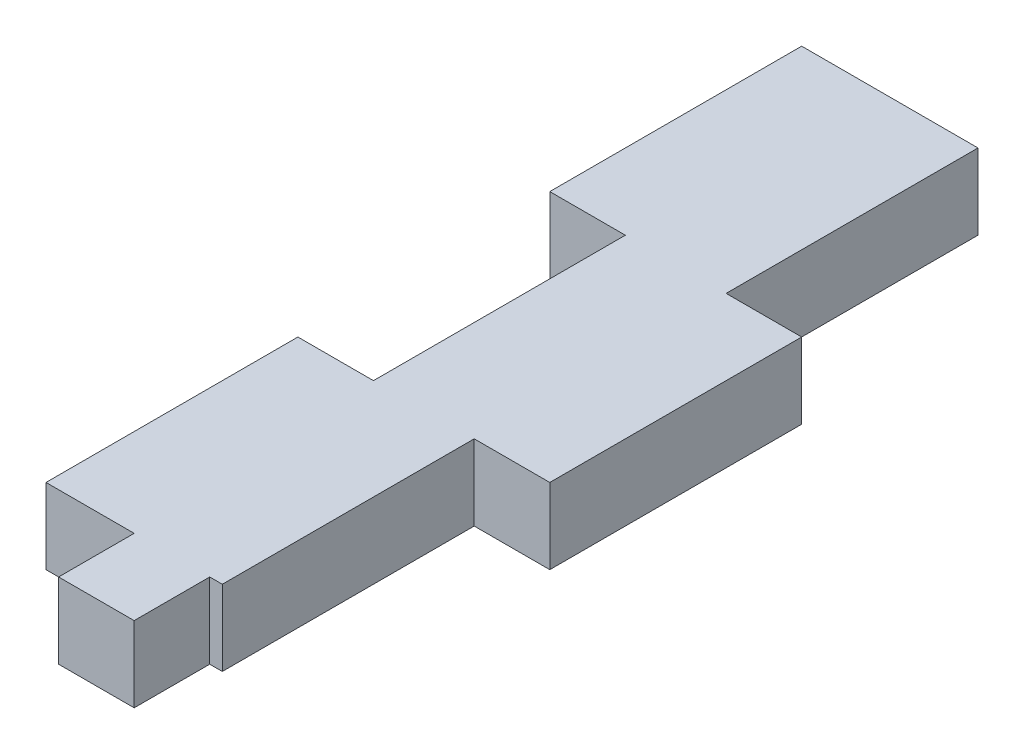
ISO-10303-21;
HEADER;
FILE_DESCRIPTION(('STEP AP214'),'2;1');
FILE_NAME('part.step','',(''),(''),'','','');
FILE_SCHEMA(('AUTOMOTIVE_DESIGN { 1 0 10303 214 1 1 1 1 }'));
ENDSEC;
DATA;
#1=APPLICATION_CONTEXT('core data for automotive mechanical design processes');
#2=APPLICATION_PROTOCOL_DEFINITION('international standard','automotive_design',2000,#1);
#3=PRODUCT_CONTEXT('',#1,'mechanical');
#4=PRODUCT('Part','Part','',(#3));
#5=PRODUCT_RELATED_PRODUCT_CATEGORY('part','',(#4));
#6=PRODUCT_DEFINITION_FORMATION('','',#4);
#7=PRODUCT_DEFINITION_CONTEXT('part definition',#1,'design');
#8=PRODUCT_DEFINITION('design','',#6,#7);
#9=PRODUCT_DEFINITION_SHAPE('','',#8);
#10=(LENGTH_UNIT() NAMED_UNIT(*) SI_UNIT(.MILLI.,.METRE.));
#11=(NAMED_UNIT(*) PLANE_ANGLE_UNIT() SI_UNIT($,.RADIAN.));
#12=(NAMED_UNIT(*) SI_UNIT($,.STERADIAN.) SOLID_ANGLE_UNIT());
#13=UNCERTAINTY_MEASURE_WITH_UNIT(LENGTH_MEASURE(1.E-05),#10,'distance_accuracy_value','');
#14=(GEOMETRIC_REPRESENTATION_CONTEXT(3) GLOBAL_UNCERTAINTY_ASSIGNED_CONTEXT((#13)) GLOBAL_UNIT_ASSIGNED_CONTEXT((#10,
#11,#12)) REPRESENTATION_CONTEXT('',''));
#15=CARTESIAN_POINT('',(0.,0.,0.));
#16=DIRECTION('',(0.,0.,1.));
#17=DIRECTION('',(1.,0.,0.));
#18=AXIS2_PLACEMENT_3D('',#15,#16,#17);
#19=CARTESIAN_POINT('',(0.,3.,10.));
#20=DIRECTION('',(0.,0.,-1.));
#21=DIRECTION('',(-1.,0.,0.));
#22=AXIS2_PLACEMENT_3D('',#19,#20,#21);
#23=PLANE('',#22);
#24=DIRECTION('',(1.,0.,0.));
#25=VECTOR('',#24,1.);
#26=CARTESIAN_POINT('',(0.,0.,10.));
#27=LINE('',#26,#25);
#28=CARTESIAN_POINT('',(0.,0.,10.));
#29=VERTEX_POINT('',#28);
#30=CARTESIAN_POINT('',(3.,0.,10.));
#31=VERTEX_POINT('',#30);
#32=EDGE_CURVE('E198',#29,#31,#27,.T.);
#33=ORIENTED_EDGE('',*,*,#32,.T.);
#34=DIRECTION('',(0.,-1.,0.));
#35=VECTOR('',#34,1.);
#36=CARTESIAN_POINT('',(3.,3.,10.));
#37=LINE('',#36,#35);
#38=CARTESIAN_POINT('',(3.,3.,10.));
#39=VERTEX_POINT('',#38);
#40=EDGE_CURVE('E11',#39,#31,#37,.T.);
#41=ORIENTED_EDGE('',*,*,#40,.F.);
#42=DIRECTION('',(1.,0.,0.));
#43=VECTOR('',#42,1.);
#44=CARTESIAN_POINT('',(0.,3.,10.));
#45=LINE('',#44,#43);
#46=CARTESIAN_POINT('',(0.,3.,10.));
#47=VERTEX_POINT('',#46);
#48=EDGE_CURVE('E375',#47,#39,#45,.T.);
#49=ORIENTED_EDGE('',*,*,#48,.F.);
#50=DIRECTION('',(0.,-1.,0.));
#51=VECTOR('',#50,1.);
#52=CARTESIAN_POINT('',(0.,3.,10.));
#53=LINE('',#52,#51);
#54=EDGE_CURVE('E192',#47,#29,#53,.T.);
#55=ORIENTED_EDGE('',*,*,#54,.T.);
#56=EDGE_LOOP('',(#33,#41,#49,#55));
#57=FACE_BOUND('',#56,.T.);
#58=ADVANCED_FACE('F47',(#57),#23,.F.);
#59=CARTESIAN_POINT('',(3.,3.,0.));
#60=DIRECTION('',(1.,0.,0.));
#61=DIRECTION('',(0.,0.,-1.));
#62=AXIS2_PLACEMENT_3D('',#59,#60,#61);
#63=PLANE('',#62);
#64=DIRECTION('',(0.,0.,1.));
#65=VECTOR('',#64,1.);
#66=CARTESIAN_POINT('',(3.,0.,0.));
#67=LINE('',#66,#65);
#68=CARTESIAN_POINT('',(3.,0.,20.));
#69=VERTEX_POINT('',#68);
#70=EDGE_CURVE('E202',#31,#69,#67,.T.);
#71=ORIENTED_EDGE('',*,*,#70,.T.);
#72=DIRECTION('',(0.,-1.,0.));
#73=VECTOR('',#72,1.);
#74=CARTESIAN_POINT('',(3.,3.,20.));
#75=LINE('',#74,#73);
#76=CARTESIAN_POINT('',(3.,3.,20.));
#77=VERTEX_POINT('',#76);
#78=EDGE_CURVE('E56',#77,#69,#75,.T.);
#79=ORIENTED_EDGE('',*,*,#78,.F.);
#80=DIRECTION('',(0.,0.,1.));
#81=VECTOR('',#80,1.);
#82=CARTESIAN_POINT('',(3.,3.,0.));
#83=LINE('',#82,#81);
#84=EDGE_CURVE('E127',#39,#77,#83,.T.);
#85=ORIENTED_EDGE('',*,*,#84,.F.);
#86=ORIENTED_EDGE('',*,*,#40,.T.);
#87=EDGE_LOOP('',(#71,#79,#85,#86));
#88=FACE_BOUND('',#87,.T.);
#89=ADVANCED_FACE('F292',(#88),#63,.F.);
#90=CARTESIAN_POINT('',(0.,3.,20.));
#91=DIRECTION('',(0.,0.,-1.));
#92=DIRECTION('',(-1.,0.,0.));
#93=AXIS2_PLACEMENT_3D('',#90,#91,#92);
#94=PLANE('',#93);
#95=DIRECTION('',(1.,0.,0.));
#96=VECTOR('',#95,1.);
#97=CARTESIAN_POINT('',(0.,0.,20.));
#98=LINE('',#97,#96);
#99=CARTESIAN_POINT('',(0.,0.,20.));
#100=VERTEX_POINT('',#99);
#101=EDGE_CURVE('E206',#100,#69,#98,.T.);
#102=ORIENTED_EDGE('',*,*,#101,.F.);
#103=DIRECTION('',(0.,-1.,0.));
#104=VECTOR('',#103,1.);
#105=CARTESIAN_POINT('',(0.,3.,20.));
#106=LINE('',#105,#104);
#107=CARTESIAN_POINT('',(0.,3.,20.));
#108=VERTEX_POINT('',#107);
#109=EDGE_CURVE('E283',#108,#100,#106,.T.);
#110=ORIENTED_EDGE('',*,*,#109,.F.);
#111=DIRECTION('',(1.,0.,0.));
#112=VECTOR('',#111,1.);
#113=CARTESIAN_POINT('',(0.,3.,20.));
#114=LINE('',#113,#112);
#115=EDGE_CURVE('E291',#108,#77,#114,.T.);
#116=ORIENTED_EDGE('',*,*,#115,.T.);
#117=ORIENTED_EDGE('',*,*,#78,.T.);
#118=EDGE_LOOP('',(#102,#110,#116,#117));
#119=FACE_BOUND('',#118,.T.);
#120=ADVANCED_FACE('F289',(#119),#94,.T.);
#121=CARTESIAN_POINT('',(0.,3.,0.));
#122=DIRECTION('',(1.,0.,0.));
#123=DIRECTION('',(0.,0.,-1.));
#124=AXIS2_PLACEMENT_3D('',#121,#122,#123);
#125=PLANE('',#124);
#126=DIRECTION('',(0.,0.,1.));
#127=VECTOR('',#126,1.);
#128=CARTESIAN_POINT('',(0.,0.,0.));
#129=LINE('',#128,#127);
#130=CARTESIAN_POINT('',(0.,0.,30.));
#131=VERTEX_POINT('',#130);
#132=EDGE_CURVE('E210',#100,#131,#129,.T.);
#133=ORIENTED_EDGE('',*,*,#132,.T.);
#134=DIRECTION('',(0.,-1.,0.));
#135=VECTOR('',#134,1.);
#136=CARTESIAN_POINT('',(0.,3.,30.));
#137=LINE('',#136,#135);
#138=CARTESIAN_POINT('',(0.,3.,30.));
#139=VERTEX_POINT('',#138);
#140=EDGE_CURVE('E279',#139,#131,#137,.T.);
#141=ORIENTED_EDGE('',*,*,#140,.F.);
#142=DIRECTION('',(0.,0.,1.));
#143=VECTOR('',#142,1.);
#144=CARTESIAN_POINT('',(0.,3.,0.));
#145=LINE('',#144,#143);
#146=EDGE_CURVE('E194',#108,#139,#145,.T.);
#147=ORIENTED_EDGE('',*,*,#146,.F.);
#148=ORIENTED_EDGE('',*,*,#109,.T.);
#149=EDGE_LOOP('',(#133,#141,#147,#148));
#150=FACE_BOUND('',#149,.T.);
#151=ADVANCED_FACE('F302',(#150),#125,.F.);
#152=CARTESIAN_POINT('',(0.,3.,30.));
#153=DIRECTION('',(0.,0.,-1.));
#154=DIRECTION('',(-1.,0.,0.));
#155=AXIS2_PLACEMENT_3D('',#152,#153,#154);
#156=PLANE('',#155);
#157=DIRECTION('',(1.,0.,0.));
#158=VECTOR('',#157,1.);
#159=CARTESIAN_POINT('',(0.,0.,30.));
#160=LINE('',#159,#158);
#161=CARTESIAN_POINT('',(3.5,0.,30.));
#162=VERTEX_POINT('',#161);
#163=EDGE_CURVE('E213',#131,#162,#160,.T.);
#164=ORIENTED_EDGE('',*,*,#163,.T.);
#165=DIRECTION('',(0.,-1.,0.));
#166=VECTOR('',#165,1.);
#167=CARTESIAN_POINT('',(3.5,3.,30.));
#168=LINE('',#167,#166);
#169=CARTESIAN_POINT('',(3.5,3.,30.));
#170=VERTEX_POINT('',#169);
#171=EDGE_CURVE('E275',#170,#162,#168,.T.);
#172=ORIENTED_EDGE('',*,*,#171,.F.);
#173=DIRECTION('',(1.,0.,0.));
#174=VECTOR('',#173,1.);
#175=CARTESIAN_POINT('',(0.,3.,30.));
#176=LINE('',#175,#174);
#177=EDGE_CURVE('E308',#139,#170,#176,.T.);
#178=ORIENTED_EDGE('',*,*,#177,.F.);
#179=ORIENTED_EDGE('',*,*,#140,.T.);
#180=EDGE_LOOP('',(#164,#172,#178,#179));
#181=FACE_BOUND('',#180,.T.);
#182=ADVANCED_FACE('F306',(#181),#156,.F.);
#183=CARTESIAN_POINT('',(3.5,3.,0.));
#184=DIRECTION('',(1.,0.,0.));
#185=DIRECTION('',(0.,0.,-1.));
#186=AXIS2_PLACEMENT_3D('',#183,#184,#185);
#187=PLANE('',#186);
#188=DIRECTION('',(0.,0.,1.));
#189=VECTOR('',#188,1.);
#190=CARTESIAN_POINT('',(3.5,0.,0.));
#191=LINE('',#190,#189);
#192=CARTESIAN_POINT('',(3.5,0.,33.));
#193=VERTEX_POINT('',#192);
#194=EDGE_CURVE('E216',#162,#193,#191,.T.);
#195=ORIENTED_EDGE('',*,*,#194,.T.);
#196=DIRECTION('',(0.,-1.,0.));
#197=VECTOR('',#196,1.);
#198=CARTESIAN_POINT('',(3.5,3.,33.));
#199=LINE('',#198,#197);
#200=CARTESIAN_POINT('',(3.5,3.,33.));
#201=VERTEX_POINT('',#200);
#202=EDGE_CURVE('E271',#201,#193,#199,.T.);
#203=ORIENTED_EDGE('',*,*,#202,.F.);
#204=DIRECTION('',(0.,0.,1.));
#205=VECTOR('',#204,1.);
#206=CARTESIAN_POINT('',(3.5,3.,0.));
#207=LINE('',#206,#205);
#208=EDGE_CURVE('E311',#170,#201,#207,.T.);
#209=ORIENTED_EDGE('',*,*,#208,.F.);
#210=ORIENTED_EDGE('',*,*,#171,.T.);
#211=EDGE_LOOP('',(#195,#203,#209,#210));
#212=FACE_BOUND('',#211,.T.);
#213=ADVANCED_FACE('F397',(#212),#187,.F.);
#214=CARTESIAN_POINT('',(0.,3.,33.));
#215=DIRECTION('',(0.,0.,-1.));
#216=DIRECTION('',(-1.,0.,0.));
#217=AXIS2_PLACEMENT_3D('',#214,#215,#216);
#218=PLANE('',#217);
#219=DIRECTION('',(1.,0.,0.));
#220=VECTOR('',#219,1.);
#221=CARTESIAN_POINT('',(0.,0.,33.));
#222=LINE('',#221,#220);
#223=CARTESIAN_POINT('',(6.5,0.,33.));
#224=VERTEX_POINT('',#223);
#225=EDGE_CURVE('E220',#193,#224,#222,.T.);
#226=ORIENTED_EDGE('',*,*,#225,.T.);
#227=DIRECTION('',(0.,-1.,0.));
#228=VECTOR('',#227,1.);
#229=CARTESIAN_POINT('',(6.5,3.,33.));
#230=LINE('',#229,#228);
#231=CARTESIAN_POINT('',(6.5,3.,33.));
#232=VERTEX_POINT('',#231);
#233=EDGE_CURVE('E268',#232,#224,#230,.T.);
#234=ORIENTED_EDGE('',*,*,#233,.F.);
#235=DIRECTION('',(1.,0.,0.));
#236=VECTOR('',#235,1.);
#237=CARTESIAN_POINT('',(0.,3.,33.));
#238=LINE('',#237,#236);
#239=EDGE_CURVE('E316',#201,#232,#238,.T.);
#240=ORIENTED_EDGE('',*,*,#239,.F.);
#241=ORIENTED_EDGE('',*,*,#202,.T.);
#242=EDGE_LOOP('',(#226,#234,#240,#241));
#243=FACE_BOUND('',#242,.T.);
#244=ADVANCED_FACE('F405',(#243),#218,.F.);
#245=CARTESIAN_POINT('',(6.50000000000001,3.,0.));
#246=DIRECTION('',(1.,0.,0.));
#247=DIRECTION('',(0.,0.,-1.));
#248=AXIS2_PLACEMENT_3D('',#245,#246,#247);
#249=PLANE('',#248);
#250=DIRECTION('',(0.,0.,1.));
#251=VECTOR('',#250,1.);
#252=CARTESIAN_POINT('',(6.50000000000001,0.,0.));
#253=LINE('',#252,#251);
#254=CARTESIAN_POINT('',(6.50000000000001,0.,30.));
#255=VERTEX_POINT('',#254);
#256=EDGE_CURVE('E224',#255,#224,#253,.T.);
#257=ORIENTED_EDGE('',*,*,#256,.F.);
#258=DIRECTION('',(0.,-1.,0.));
#259=VECTOR('',#258,1.);
#260=CARTESIAN_POINT('',(6.50000000000001,3.,30.));
#261=LINE('',#260,#259);
#262=CARTESIAN_POINT('',(6.50000000000001,3.,30.));
#263=VERTEX_POINT('',#262);
#264=EDGE_CURVE('E265',#263,#255,#261,.T.);
#265=ORIENTED_EDGE('',*,*,#264,.F.);
#266=DIRECTION('',(0.,0.,1.));
#267=VECTOR('',#266,1.);
#268=CARTESIAN_POINT('',(6.50000000000001,3.,0.));
#269=LINE('',#268,#267);
#270=EDGE_CURVE('E319',#263,#232,#269,.T.);
#271=ORIENTED_EDGE('',*,*,#270,.T.);
#272=ORIENTED_EDGE('',*,*,#233,.T.);
#273=EDGE_LOOP('',(#257,#265,#271,#272));
#274=FACE_BOUND('',#273,.T.);
#275=ADVANCED_FACE('F409',(#274),#249,.T.);
#276=CARTESIAN_POINT('',(7.,0.,30.));
#277=VERTEX_POINT('',#276);
#278=EDGE_CURVE('E217',#255,#277,#160,.T.);
#279=ORIENTED_EDGE('',*,*,#278,.T.);
#280=DIRECTION('',(0.,-1.,0.));
#281=VECTOR('',#280,1.);
#282=CARTESIAN_POINT('',(7.,3.,30.));
#283=LINE('',#282,#281);
#284=CARTESIAN_POINT('',(7.,3.,30.));
#285=VERTEX_POINT('',#284);
#286=EDGE_CURVE('E262',#285,#277,#283,.T.);
#287=ORIENTED_EDGE('',*,*,#286,.F.);
#288=EDGE_CURVE('E313',#263,#285,#176,.T.);
#289=ORIENTED_EDGE('',*,*,#288,.F.);
#290=ORIENTED_EDGE('',*,*,#264,.T.);
#291=EDGE_LOOP('',(#279,#287,#289,#290));
#292=FACE_BOUND('',#291,.T.);
#293=ADVANCED_FACE('F350',(#292),#156,.F.);
#294=CARTESIAN_POINT('',(7.,3.,0.));
#295=DIRECTION('',(1.,0.,0.));
#296=DIRECTION('',(0.,0.,-1.));
#297=AXIS2_PLACEMENT_3D('',#294,#295,#296);
#298=PLANE('',#297);
#299=DIRECTION('',(0.,0.,1.));
#300=VECTOR('',#299,1.);
#301=CARTESIAN_POINT('',(7.,0.,0.));
#302=LINE('',#301,#300);
#303=CARTESIAN_POINT('',(7.,0.,20.));
#304=VERTEX_POINT('',#303);
#305=EDGE_CURVE('E228',#304,#277,#302,.T.);
#306=ORIENTED_EDGE('',*,*,#305,.F.);
#307=DIRECTION('',(0.,-1.,0.));
#308=VECTOR('',#307,1.);
#309=CARTESIAN_POINT('',(7.,3.,20.));
#310=LINE('',#309,#308);
#311=CARTESIAN_POINT('',(7.,3.,20.));
#312=VERTEX_POINT('',#311);
#313=EDGE_CURVE('E259',#312,#304,#310,.T.);
#314=ORIENTED_EDGE('',*,*,#313,.F.);
#315=DIRECTION('',(0.,0.,1.));
#316=VECTOR('',#315,1.);
#317=CARTESIAN_POINT('',(7.,3.,0.));
#318=LINE('',#317,#316);
#319=EDGE_CURVE('E187',#312,#285,#318,.T.);
#320=ORIENTED_EDGE('',*,*,#319,.T.);
#321=ORIENTED_EDGE('',*,*,#286,.T.);
#322=EDGE_LOOP('',(#306,#314,#320,#321));
#323=FACE_BOUND('',#322,.T.);
#324=ADVANCED_FACE('F355',(#323),#298,.T.);
#325=CARTESIAN_POINT('',(0.,3.,20.));
#326=DIRECTION('',(0.,0.,-1.));
#327=DIRECTION('',(-1.,0.,0.));
#328=AXIS2_PLACEMENT_3D('',#325,#326,#327);
#329=PLANE('',#328);
#330=DIRECTION('',(1.,0.,0.));
#331=VECTOR('',#330,1.);
#332=CARTESIAN_POINT('',(0.,0.,20.));
#333=LINE('',#332,#331);
#334=CARTESIAN_POINT('',(10.,0.,20.));
#335=VERTEX_POINT('',#334);
#336=EDGE_CURVE('E232',#304,#335,#333,.T.);
#337=ORIENTED_EDGE('',*,*,#336,.T.);
#338=DIRECTION('',(0.,-1.,0.));
#339=VECTOR('',#338,1.);
#340=CARTESIAN_POINT('',(10.,3.,20.));
#341=LINE('',#340,#339);
#342=CARTESIAN_POINT('',(10.,3.,20.));
#343=VERTEX_POINT('',#342);
#344=EDGE_CURVE('E256',#343,#335,#341,.T.);
#345=ORIENTED_EDGE('',*,*,#344,.F.);
#346=DIRECTION('',(1.,0.,0.));
#347=VECTOR('',#346,1.);
#348=CARTESIAN_POINT('',(0.,3.,20.));
#349=LINE('',#348,#347);
#350=EDGE_CURVE('E327',#312,#343,#349,.T.);
#351=ORIENTED_EDGE('',*,*,#350,.F.);
#352=ORIENTED_EDGE('',*,*,#313,.T.);
#353=EDGE_LOOP('',(#337,#345,#351,#352));
#354=FACE_BOUND('',#353,.T.);
#355=ADVANCED_FACE('F359',(#354),#329,.F.);
#356=CARTESIAN_POINT('',(10.,3.,0.));
#357=DIRECTION('',(1.,0.,0.));
#358=DIRECTION('',(0.,0.,-1.));
#359=AXIS2_PLACEMENT_3D('',#356,#357,#358);
#360=PLANE('',#359);
#361=DIRECTION('',(0.,0.,1.));
#362=VECTOR('',#361,1.);
#363=CARTESIAN_POINT('',(10.,0.,0.));
#364=LINE('',#363,#362);
#365=CARTESIAN_POINT('',(10.,0.,10.));
#366=VERTEX_POINT('',#365);
#367=EDGE_CURVE('E236',#366,#335,#364,.T.);
#368=ORIENTED_EDGE('',*,*,#367,.F.);
#369=DIRECTION('',(0.,-1.,0.));
#370=VECTOR('',#369,1.);
#371=CARTESIAN_POINT('',(10.,3.,10.));
#372=LINE('',#371,#370);
#373=CARTESIAN_POINT('',(10.,3.,10.));
#374=VERTEX_POINT('',#373);
#375=EDGE_CURVE('E253',#374,#366,#372,.T.);
#376=ORIENTED_EDGE('',*,*,#375,.F.);
#377=DIRECTION('',(0.,0.,1.));
#378=VECTOR('',#377,1.);
#379=CARTESIAN_POINT('',(10.,3.,0.));
#380=LINE('',#379,#378);
#381=EDGE_CURVE('E335',#374,#343,#380,.T.);
#382=ORIENTED_EDGE('',*,*,#381,.T.);
#383=ORIENTED_EDGE('',*,*,#344,.T.);
#384=EDGE_LOOP('',(#368,#376,#382,#383));
#385=FACE_BOUND('',#384,.T.);
#386=ADVANCED_FACE('F360',(#385),#360,.T.);
#387=CARTESIAN_POINT('',(0.,3.,10.));
#388=DIRECTION('',(0.,0.,-1.));
#389=DIRECTION('',(-1.,0.,0.));
#390=AXIS2_PLACEMENT_3D('',#387,#388,#389);
#391=PLANE('',#390);
#392=DIRECTION('',(1.,0.,0.));
#393=VECTOR('',#392,1.);
#394=CARTESIAN_POINT('',(0.,0.,10.));
#395=LINE('',#394,#393);
#396=CARTESIAN_POINT('',(7.,0.,10.));
#397=VERTEX_POINT('',#396);
#398=EDGE_CURVE('E240',#397,#366,#395,.T.);
#399=ORIENTED_EDGE('',*,*,#398,.F.);
#400=DIRECTION('',(0.,-1.,0.));
#401=VECTOR('',#400,1.);
#402=CARTESIAN_POINT('',(7.,3.,10.));
#403=LINE('',#402,#401);
#404=CARTESIAN_POINT('',(7.,3.,10.));
#405=VERTEX_POINT('',#404);
#406=EDGE_CURVE('E177',#405,#397,#403,.T.);
#407=ORIENTED_EDGE('',*,*,#406,.F.);
#408=DIRECTION('',(1.,0.,0.));
#409=VECTOR('',#408,1.);
#410=CARTESIAN_POINT('',(0.,3.,10.));
#411=LINE('',#410,#409);
#412=EDGE_CURVE('E184',#405,#374,#411,.T.);
#413=ORIENTED_EDGE('',*,*,#412,.T.);
#414=ORIENTED_EDGE('',*,*,#375,.T.);
#415=EDGE_LOOP('',(#399,#407,#413,#414));
#416=FACE_BOUND('',#415,.T.);
#417=ADVANCED_FACE('F342',(#416),#391,.T.);
#418=CARTESIAN_POINT('',(7.,0.,0.));
#419=VERTEX_POINT('',#418);
#420=EDGE_CURVE('E171',#419,#397,#302,.T.);
#421=ORIENTED_EDGE('',*,*,#420,.F.);
#422=DIRECTION('',(0.,-1.,0.));
#423=VECTOR('',#422,1.);
#424=CARTESIAN_POINT('',(7.,3.,0.));
#425=LINE('',#424,#423);
#426=CARTESIAN_POINT('',(7.,3.,0.));
#427=VERTEX_POINT('',#426);
#428=EDGE_CURVE('E166',#427,#419,#425,.T.);
#429=ORIENTED_EDGE('',*,*,#428,.F.);
#430=EDGE_CURVE('E169',#427,#405,#318,.T.);
#431=ORIENTED_EDGE('',*,*,#430,.T.);
#432=ORIENTED_EDGE('',*,*,#406,.T.);
#433=EDGE_LOOP('',(#421,#429,#431,#432));
#434=FACE_BOUND('',#433,.T.);
#435=ADVANCED_FACE('F168',(#434),#298,.T.);
#436=CARTESIAN_POINT('',(0.,3.,0.));
#437=DIRECTION('',(0.,0.,-1.));
#438=DIRECTION('',(-1.,0.,0.));
#439=AXIS2_PLACEMENT_3D('',#436,#437,#438);
#440=PLANE('',#439);
#441=DIRECTION('',(1.,0.,0.));
#442=VECTOR('',#441,1.);
#443=CARTESIAN_POINT('',(0.,0.,0.));
#444=LINE('',#443,#442);
#445=CARTESIAN_POINT('',(0.,0.,0.));
#446=VERTEX_POINT('',#445);
#447=EDGE_CURVE('E244',#446,#419,#444,.T.);
#448=ORIENTED_EDGE('',*,*,#447,.F.);
#449=DIRECTION('',(0.,-1.,0.));
#450=VECTOR('',#449,1.);
#451=CARTESIAN_POINT('',(0.,3.,0.));
#452=LINE('',#451,#450);
#453=CARTESIAN_POINT('',(0.,3.,0.));
#454=VERTEX_POINT('',#453);
#455=EDGE_CURVE('E116',#454,#446,#452,.T.);
#456=ORIENTED_EDGE('',*,*,#455,.F.);
#457=DIRECTION('',(1.,0.,0.));
#458=VECTOR('',#457,1.);
#459=CARTESIAN_POINT('',(0.,3.,0.));
#460=LINE('',#459,#458);
#461=EDGE_CURVE('E181',#454,#427,#460,.T.);
#462=ORIENTED_EDGE('',*,*,#461,.T.);
#463=ORIENTED_EDGE('',*,*,#428,.T.);
#464=EDGE_LOOP('',(#448,#456,#462,#463));
#465=FACE_BOUND('',#464,.T.);
#466=ADVANCED_FACE('F188',(#465),#440,.T.);
#467=EDGE_CURVE('E119',#446,#29,#129,.T.);
#468=ORIENTED_EDGE('',*,*,#467,.T.);
#469=ORIENTED_EDGE('',*,*,#54,.F.);
#470=EDGE_CURVE('E64',#454,#47,#145,.T.);
#471=ORIENTED_EDGE('',*,*,#470,.F.);
#472=ORIENTED_EDGE('',*,*,#455,.T.);
#473=EDGE_LOOP('',(#468,#469,#471,#472));
#474=FACE_BOUND('',#473,.T.);
#475=ADVANCED_FACE('F382',(#474),#125,.F.);
#476=CARTESIAN_POINT('',(0.,3.,0.));
#477=DIRECTION('',(0.,1.,0.));
#478=DIRECTION('',(0.,0.,1.));
#479=AXIS2_PLACEMENT_3D('',#476,#477,#478);
#480=PLANE('',#479);
#481=ORIENTED_EDGE('',*,*,#48,.T.);
#482=ORIENTED_EDGE('',*,*,#84,.T.);
#483=ORIENTED_EDGE('',*,*,#115,.F.);
#484=ORIENTED_EDGE('',*,*,#146,.T.);
#485=ORIENTED_EDGE('',*,*,#177,.T.);
#486=ORIENTED_EDGE('',*,*,#208,.T.);
#487=ORIENTED_EDGE('',*,*,#239,.T.);
#488=ORIENTED_EDGE('',*,*,#270,.F.);
#489=ORIENTED_EDGE('',*,*,#288,.T.);
#490=ORIENTED_EDGE('',*,*,#319,.F.);
#491=ORIENTED_EDGE('',*,*,#350,.T.);
#492=ORIENTED_EDGE('',*,*,#381,.F.);
#493=ORIENTED_EDGE('',*,*,#412,.F.);
#494=ORIENTED_EDGE('',*,*,#430,.F.);
#495=ORIENTED_EDGE('',*,*,#461,.F.);
#496=ORIENTED_EDGE('',*,*,#470,.T.);
#497=EDGE_LOOP('',(#481,#482,#483,#484,#485,#486,#487,#488,#489,#490,#491,#492,#493,#494,#495,#496));
#498=FACE_BOUND('',#497,.T.);
#499=ADVANCED_FACE('F180',(#498),#480,.T.);
#500=CARTESIAN_POINT('',(0.,0.,0.));
#501=DIRECTION('',(0.,1.,0.));
#502=DIRECTION('',(0.,0.,1.));
#503=AXIS2_PLACEMENT_3D('',#500,#501,#502);
#504=PLANE('',#503);
#505=ORIENTED_EDGE('',*,*,#32,.F.);
#506=ORIENTED_EDGE('',*,*,#467,.F.);
#507=ORIENTED_EDGE('',*,*,#447,.T.);
#508=ORIENTED_EDGE('',*,*,#420,.T.);
#509=ORIENTED_EDGE('',*,*,#398,.T.);
#510=ORIENTED_EDGE('',*,*,#367,.T.);
#511=ORIENTED_EDGE('',*,*,#336,.F.);
#512=ORIENTED_EDGE('',*,*,#305,.T.);
#513=ORIENTED_EDGE('',*,*,#278,.F.);
#514=ORIENTED_EDGE('',*,*,#256,.T.);
#515=ORIENTED_EDGE('',*,*,#225,.F.);
#516=ORIENTED_EDGE('',*,*,#194,.F.);
#517=ORIENTED_EDGE('',*,*,#163,.F.);
#518=ORIENTED_EDGE('',*,*,#132,.F.);
#519=ORIENTED_EDGE('',*,*,#101,.T.);
#520=ORIENTED_EDGE('',*,*,#70,.F.);
#521=EDGE_LOOP('',(#505,#506,#507,#508,#509,#510,#511,#512,#513,#514,#515,#516,#517,#518,#519,#520));
#522=FACE_BOUND('',#521,.T.);
#523=ADVANCED_FACE('F297',(#522),#504,.F.);
#524=CLOSED_SHELL('',(#58,#89,#120,#151,#182,#213,#244,#275,#293,#324,#355,#386,#417,#435,#466,
#475,#499,#523));
#525=MANIFOLD_SOLID_BREP('B2',#524);
#526=ADVANCED_BREP_SHAPE_REPRESENTATION('',(#18,#525),#14);
#527=SHAPE_DEFINITION_REPRESENTATION(#9,#526);
ENDSEC;
END-ISO-10303-21;
